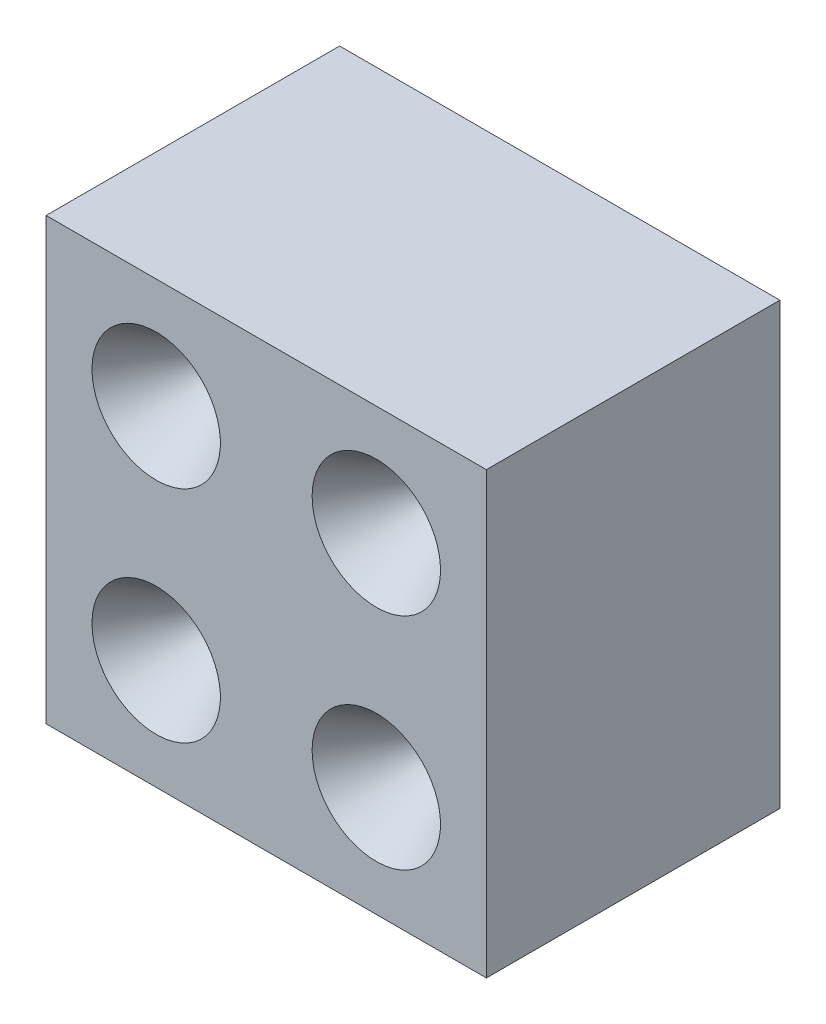
ISO-10303-21;
HEADER;
FILE_DESCRIPTION(('STEP AP214'),'2;1');
FILE_NAME('part.step','',(''),(''),'','','');
FILE_SCHEMA(('AUTOMOTIVE_DESIGN { 1 0 10303 214 1 1 1 1 }'));
ENDSEC;
DATA;
#1=APPLICATION_CONTEXT('core data for automotive mechanical design processes');
#2=APPLICATION_PROTOCOL_DEFINITION('international standard','automotive_design',2000,#1);
#3=PRODUCT_CONTEXT('',#1,'mechanical');
#4=PRODUCT('Part','Part','',(#3));
#5=PRODUCT_RELATED_PRODUCT_CATEGORY('part','',(#4));
#6=PRODUCT_DEFINITION_FORMATION('','',#4);
#7=PRODUCT_DEFINITION_CONTEXT('part definition',#1,'design');
#8=PRODUCT_DEFINITION('design','',#6,#7);
#9=PRODUCT_DEFINITION_SHAPE('','',#8);
#10=(LENGTH_UNIT() NAMED_UNIT(*) SI_UNIT(.MILLI.,.METRE.));
#11=(NAMED_UNIT(*) PLANE_ANGLE_UNIT() SI_UNIT($,.RADIAN.));
#12=(NAMED_UNIT(*) SI_UNIT($,.STERADIAN.) SOLID_ANGLE_UNIT());
#13=UNCERTAINTY_MEASURE_WITH_UNIT(LENGTH_MEASURE(1.E-05),#10,'distance_accuracy_value','');
#14=(GEOMETRIC_REPRESENTATION_CONTEXT(3) GLOBAL_UNCERTAINTY_ASSIGNED_CONTEXT((#13)) GLOBAL_UNIT_ASSIGNED_CONTEXT((#10,
#11,#12)) REPRESENTATION_CONTEXT('',''));
#15=CARTESIAN_POINT('',(0.,0.,0.));
#16=DIRECTION('',(0.,0.,1.));
#17=DIRECTION('',(1.,0.,0.));
#18=AXIS2_PLACEMENT_3D('',#15,#16,#17);
#19=CARTESIAN_POINT('',(0.,0.,2032.));
#20=DIRECTION('',(1.,0.,0.));
#21=DIRECTION('',(0.,0.,-1.));
#22=AXIS2_PLACEMENT_3D('',#19,#20,#21);
#23=PLANE('',#22);
#24=DIRECTION('',(0.,-1.,0.));
#25=VECTOR('',#24,1.);
#26=CARTESIAN_POINT('',(0.,0.,0.));
#27=LINE('',#26,#25);
#28=CARTESIAN_POINT('',(0.,3048.,0.));
#29=VERTEX_POINT('',#28);
#30=CARTESIAN_POINT('',(0.,0.,0.));
#31=VERTEX_POINT('',#30);
#32=EDGE_CURVE('E111',#29,#31,#27,.T.);
#33=ORIENTED_EDGE('',*,*,#32,.T.);
#34=DIRECTION('',(0.,0.,-1.));
#35=VECTOR('',#34,1.);
#36=CARTESIAN_POINT('',(0.,0.,2032.));
#37=LINE('',#36,#35);
#38=CARTESIAN_POINT('',(0.,0.,2032.));
#39=VERTEX_POINT('',#38);
#40=EDGE_CURVE('E12',#39,#31,#37,.T.);
#41=ORIENTED_EDGE('',*,*,#40,.F.);
#42=DIRECTION('',(0.,-1.,0.));
#43=VECTOR('',#42,1.);
#44=CARTESIAN_POINT('',(0.,0.,2032.));
#45=LINE('',#44,#43);
#46=CARTESIAN_POINT('',(0.,3048.,2032.));
#47=VERTEX_POINT('',#46);
#48=EDGE_CURVE('E98',#47,#39,#45,.T.);
#49=ORIENTED_EDGE('',*,*,#48,.F.);
#50=DIRECTION('',(0.,0.,-1.));
#51=VECTOR('',#50,1.);
#52=CARTESIAN_POINT('',(0.,3048.,2032.));
#53=LINE('',#52,#51);
#54=EDGE_CURVE('E107',#47,#29,#53,.T.);
#55=ORIENTED_EDGE('',*,*,#54,.T.);
#56=EDGE_LOOP('',(#33,#41,#49,#55));
#57=FACE_BOUND('',#56,.T.);
#58=ADVANCED_FACE('F43',(#57),#23,.F.);
#59=CARTESIAN_POINT('',(0.,0.,2032.));
#60=DIRECTION('',(0.,1.,0.));
#61=DIRECTION('',(0.,0.,1.));
#62=AXIS2_PLACEMENT_3D('',#59,#60,#61);
#63=PLANE('',#62);
#64=DIRECTION('',(1.,0.,0.));
#65=VECTOR('',#64,1.);
#66=CARTESIAN_POINT('',(0.,0.,0.));
#67=LINE('',#66,#65);
#68=CARTESIAN_POINT('',(3048.,0.,0.));
#69=VERTEX_POINT('',#68);
#70=EDGE_CURVE('E102',#31,#69,#67,.T.);
#71=ORIENTED_EDGE('',*,*,#70,.T.);
#72=DIRECTION('',(0.,0.,-1.));
#73=VECTOR('',#72,1.);
#74=CARTESIAN_POINT('',(3048.,0.,2032.));
#75=LINE('',#74,#73);
#76=CARTESIAN_POINT('',(3048.,0.,2032.));
#77=VERTEX_POINT('',#76);
#78=EDGE_CURVE('E54',#77,#69,#75,.T.);
#79=ORIENTED_EDGE('',*,*,#78,.F.);
#80=DIRECTION('',(1.,0.,0.));
#81=VECTOR('',#80,1.);
#82=CARTESIAN_POINT('',(0.,0.,2032.));
#83=LINE('',#82,#81);
#84=EDGE_CURVE('E93',#39,#77,#83,.T.);
#85=ORIENTED_EDGE('',*,*,#84,.F.);
#86=ORIENTED_EDGE('',*,*,#40,.T.);
#87=EDGE_LOOP('',(#71,#79,#85,#86));
#88=FACE_BOUND('',#87,.T.);
#89=ADVANCED_FACE('F101',(#88),#63,.F.);
#90=CARTESIAN_POINT('',(3048.,0.,2032.));
#91=DIRECTION('',(-1.,0.,0.));
#92=DIRECTION('',(0.,0.,1.));
#93=AXIS2_PLACEMENT_3D('',#90,#91,#92);
#94=PLANE('',#93);
#95=DIRECTION('',(0.,1.,0.));
#96=VECTOR('',#95,1.);
#97=CARTESIAN_POINT('',(3048.,0.,0.));
#98=LINE('',#97,#96);
#99=CARTESIAN_POINT('',(3048.,3048.,0.));
#100=VERTEX_POINT('',#99);
#101=EDGE_CURVE('E80',#69,#100,#98,.T.);
#102=ORIENTED_EDGE('',*,*,#101,.T.);
#103=DIRECTION('',(0.,0.,-1.));
#104=VECTOR('',#103,1.);
#105=CARTESIAN_POINT('',(3048.,3048.,2032.));
#106=LINE('',#105,#104);
#107=CARTESIAN_POINT('',(3048.,3048.,2032.));
#108=VERTEX_POINT('',#107);
#109=EDGE_CURVE('E103',#108,#100,#106,.T.);
#110=ORIENTED_EDGE('',*,*,#109,.F.);
#111=DIRECTION('',(0.,1.,0.));
#112=VECTOR('',#111,1.);
#113=CARTESIAN_POINT('',(3048.,0.,2032.));
#114=LINE('',#113,#112);
#115=EDGE_CURVE('E96',#77,#108,#114,.T.);
#116=ORIENTED_EDGE('',*,*,#115,.F.);
#117=ORIENTED_EDGE('',*,*,#78,.T.);
#118=EDGE_LOOP('',(#102,#110,#116,#117));
#119=FACE_BOUND('',#118,.T.);
#120=ADVANCED_FACE('F105',(#119),#94,.F.);
#121=CARTESIAN_POINT('',(0.,3048.,2032.));
#122=DIRECTION('',(0.,-1.,0.));
#123=DIRECTION('',(0.,0.,-1.));
#124=AXIS2_PLACEMENT_3D('',#121,#122,#123);
#125=PLANE('',#124);
#126=DIRECTION('',(-1.,0.,0.));
#127=VECTOR('',#126,1.);
#128=CARTESIAN_POINT('',(0.,3048.,0.));
#129=LINE('',#128,#127);
#130=EDGE_CURVE('E86',#100,#29,#129,.T.);
#131=ORIENTED_EDGE('',*,*,#130,.T.);
#132=ORIENTED_EDGE('',*,*,#54,.F.);
#133=DIRECTION('',(-1.,0.,0.));
#134=VECTOR('',#133,1.);
#135=CARTESIAN_POINT('',(0.,3048.,2032.));
#136=LINE('',#135,#134);
#137=EDGE_CURVE('E63',#108,#47,#136,.T.);
#138=ORIENTED_EDGE('',*,*,#137,.F.);
#139=ORIENTED_EDGE('',*,*,#109,.T.);
#140=EDGE_LOOP('',(#131,#132,#138,#139));
#141=FACE_BOUND('',#140,.T.);
#142=ADVANCED_FACE('F140',(#141),#125,.F.);
#143=CARTESIAN_POINT('',(0.,0.,2032.));
#144=DIRECTION('',(0.,0.,-1.));
#145=DIRECTION('',(-1.,0.,0.));
#146=AXIS2_PLACEMENT_3D('',#143,#144,#145);
#147=PLANE('',#146);
#148=CARTESIAN_POINT('',(2286.,762.,2032.));
#149=DIRECTION('',(0.,0.,1.));
#150=DIRECTION('',(1.,0.,0.));
#151=AXIS2_PLACEMENT_3D('',#148,#149,#150);
#152=CIRCLE('',#151,444.5);
#153=CARTESIAN_POINT('',(2729.52998755363,732.650380910873,2032.));
#154=VERTEX_POINT('',#153);
#155=EDGE_CURVE('E163',#154,#154,#152,.T.);
#156=ORIENTED_EDGE('',*,*,#155,.F.);
#157=EDGE_LOOP('',(#156));
#158=FACE_BOUND('',#157,.T.);
#159=CARTESIAN_POINT('',(2286.,2286.,2032.));
#160=DIRECTION('',(0.,0.,1.));
#161=DIRECTION('',(1.,0.,0.));
#162=AXIS2_PLACEMENT_3D('',#159,#160,#161);
#163=CIRCLE('',#162,444.5);
#164=CARTESIAN_POINT('',(2729.52998755363,2256.65038091087,2032.));
#165=VERTEX_POINT('',#164);
#166=EDGE_CURVE('E170',#165,#165,#163,.T.);
#167=ORIENTED_EDGE('',*,*,#166,.F.);
#168=EDGE_LOOP('',(#167));
#169=FACE_BOUND('',#168,.T.);
#170=CARTESIAN_POINT('',(762.,762.,2032.));
#171=DIRECTION('',(0.,0.,1.));
#172=DIRECTION('',(1.,0.,0.));
#173=AXIS2_PLACEMENT_3D('',#170,#171,#172);
#174=CIRCLE('',#173,444.5);
#175=CARTESIAN_POINT('',(1205.52998755363,732.650380910873,2032.));
#176=VERTEX_POINT('',#175);
#177=EDGE_CURVE('E248',#176,#176,#174,.T.);
#178=ORIENTED_EDGE('',*,*,#177,.F.);
#179=EDGE_LOOP('',(#178));
#180=FACE_BOUND('',#179,.T.);
#181=CARTESIAN_POINT('',(762.,2286.,2032.));
#182=DIRECTION('',(0.,0.,1.));
#183=DIRECTION('',(1.,0.,0.));
#184=AXIS2_PLACEMENT_3D('',#181,#182,#183);
#185=CIRCLE('',#184,444.5);
#186=CARTESIAN_POINT('',(1205.52998755363,2256.65038091087,2032.));
#187=VERTEX_POINT('',#186);
#188=EDGE_CURVE('E124',#187,#187,#185,.T.);
#189=ORIENTED_EDGE('',*,*,#188,.F.);
#190=EDGE_LOOP('',(#189));
#191=FACE_BOUND('',#190,.T.);
#192=ORIENTED_EDGE('',*,*,#48,.T.);
#193=ORIENTED_EDGE('',*,*,#84,.T.);
#194=ORIENTED_EDGE('',*,*,#115,.T.);
#195=ORIENTED_EDGE('',*,*,#137,.T.);
#196=EDGE_LOOP('',(#192,#193,#194,#195));
#197=FACE_BOUND('',#196,.T.);
#198=ADVANCED_FACE('F94',(#158,#169,#180,#191,#197),#147,.F.);
#199=CARTESIAN_POINT('',(0.,0.,0.));
#200=DIRECTION('',(0.,0.,-1.));
#201=DIRECTION('',(-1.,0.,0.));
#202=AXIS2_PLACEMENT_3D('',#199,#200,#201);
#203=PLANE('',#202);
#204=ORIENTED_EDGE('',*,*,#32,.F.);
#205=ORIENTED_EDGE('',*,*,#130,.F.);
#206=ORIENTED_EDGE('',*,*,#101,.F.);
#207=ORIENTED_EDGE('',*,*,#70,.F.);
#208=EDGE_LOOP('',(#204,#205,#206,#207));
#209=FACE_BOUND('',#208,.T.);
#210=ADVANCED_FACE('F139',(#209),#203,.T.);
#211=CARTESIAN_POINT('',(762.,2286.,1524.));
#212=DIRECTION('',(0.,0.,1.));
#213=DIRECTION('',(1.,0.,0.));
#214=AXIS2_PLACEMENT_3D('',#211,#212,#213);
#215=PLANE('',#214);
#216=CARTESIAN_POINT('',(762.,2286.,1524.));
#217=DIRECTION('',(0.,0.,1.));
#218=DIRECTION('',(1.,0.,0.));
#219=AXIS2_PLACEMENT_3D('',#216,#217,#218);
#220=CIRCLE('',#219,127.);
#221=CARTESIAN_POINT('',(885.845653168388,2314.12924085885,1524.));
#222=VERTEX_POINT('',#221);
#223=EDGE_CURVE('E114',#222,#222,#220,.T.);
#224=ORIENTED_EDGE('',*,*,#223,.T.);
#225=EDGE_LOOP('',(#224));
#226=FACE_BOUND('',#225,.T.);
#227=ADVANCED_FACE('F142',(#226),#215,.T.);
#228=CARTESIAN_POINT('',(1205.52998755363,2256.65038091087,2032.));
#229=CARTESIAN_POINT('',(885.845653168388,2314.12924085885,1524.));
#230=CARTESIAN_POINT('',(1146.83074937538,1369.59040580361,2032.));
#231=CARTESIAN_POINT('',(942.10413488609,2066.43793452207,1524.));
#232=CARTESIAN_POINT('',(259.770774268116,1428.28964398187,2032.));
#233=CARTESIAN_POINT('',(694.412828549313,2010.17945280437,1524.));
#234=CARTESIAN_POINT('',(318.47001244637,2315.34961908913,2032.));
#235=CARTESIAN_POINT('',(638.154346831612,2257.87075914115,1524.));
#236=CARTESIAN_POINT('',(377.169250624623,3202.40959419639,2032.));
#237=CARTESIAN_POINT('',(581.89586511391,2505.56206547793,1524.));
#238=CARTESIAN_POINT('',(1264.22922573188,3143.71035601813,2032.));
#239=CARTESIAN_POINT('',(829.587171450686,2561.82054719563,1524.));
#240=CARTESIAN_POINT('',(1205.52998755363,2256.65038091087,2032.));
#241=CARTESIAN_POINT('',(885.845653168388,2314.12924085885,1524.));
#242=(BOUNDED_SURFACE() B_SPLINE_SURFACE(3,1,((#228,#229),(#230,#231),(#232,#233),(#234,#235),
(#236,#237),(#238,#239),(#240,#241)),.UNSPECIFIED.,.T.,.F.,.F.) B_SPLINE_SURFACE_WITH_KNOTS((4,
3,4),(2,2),(0.,0.5,1.),(0.,1.),
.UNSPECIFIED.) GEOMETRIC_REPRESENTATION_ITEM() RATIONAL_B_SPLINE_SURFACE(((1.,1.),
(0.333333333333333,0.333333333333333),(0.333333333333333,0.333333333333333),(1.,1.),
(0.333333333333333,0.333333333333333),(0.333333333333333,0.333333333333333),(1.,1.))) REPRESENTATION_ITEM('') SURFACE());
#243=CARTESIAN_POINT('',(1205.52998755363,2256.65038091087,2032.));
#244=CARTESIAN_POINT('',(1202.19994240378,2257.24911903533,2026.70833333333));
#245=CARTESIAN_POINT('',(1198.86989725394,2257.84785715979,2021.41666666667));
#246=CARTESIAN_POINT('',(1192.20980695425,2259.04533340871,2010.83333333333));
#247=CARTESIAN_POINT('',(1188.8797618044,2259.64407153316,2005.54166666667));
#248=CARTESIAN_POINT('',(1182.21967150471,2260.84154778208,1994.95833333333));
#249=CARTESIAN_POINT('',(1178.88962635486,2261.44028590654,1989.66666666667));
#250=CARTESIAN_POINT('',(1172.22953605517,2262.63776215545,1979.08333333333));
#251=CARTESIAN_POINT('',(1168.89949090532,2263.23650027991,1973.79166666667));
#252=CARTESIAN_POINT('',(1162.23940060563,2264.43397652883,1963.20833333333));
#253=CARTESIAN_POINT('',(1158.90935545578,2265.03271465329,1957.91666666667));
#254=CARTESIAN_POINT('',(1152.24926515609,2266.2301909022,1947.33333333333));
#255=CARTESIAN_POINT('',(1148.91922000624,2266.82892902666,1942.04166666667));
#256=CARTESIAN_POINT('',(1142.25912970655,2268.02640527558,1931.45833333333));
#257=CARTESIAN_POINT('',(1138.9290845567,2268.62514340004,1926.16666666667));
#258=CARTESIAN_POINT('',(1132.26899425701,2269.82261964895,1915.58333333333));
#259=CARTESIAN_POINT('',(1128.93894910717,2270.42135777341,1910.29166666667));
#260=CARTESIAN_POINT('',(1122.27885880747,2271.61883402233,1899.70833333333));
#261=CARTESIAN_POINT('',(1118.94881365763,2272.21757214678,1894.41666666667));
#262=CARTESIAN_POINT('',(1112.28872335793,2273.4150483957,1883.83333333333));
#263=CARTESIAN_POINT('',(1108.95867820809,2274.01378652016,1878.54166666667));
#264=CARTESIAN_POINT('',(1102.2985879084,2275.21126276907,1867.95833333333));
#265=CARTESIAN_POINT('',(1098.96854275855,2275.81000089353,1862.66666666667));
#266=CARTESIAN_POINT('',(1092.30845245886,2277.00747714245,1852.08333333333));
#267=CARTESIAN_POINT('',(1088.97840730901,2277.60621526691,1846.79166666667));
#268=CARTESIAN_POINT('',(1082.31831700932,2278.80369151582,1836.20833333333));
#269=CARTESIAN_POINT('',(1078.98827185947,2279.40242964028,1830.91666666667));
#270=CARTESIAN_POINT('',(1072.32818155978,2280.5999058892,1820.33333333333));
#271=CARTESIAN_POINT('',(1068.99813640993,2281.19864401366,1815.04166666667));
#272=CARTESIAN_POINT('',(1062.33804611024,2282.39612026257,1804.45833333333));
#273=CARTESIAN_POINT('',(1059.00800096039,2282.99485838703,1799.16666666667));
#274=CARTESIAN_POINT('',(1052.3479106607,2284.19233463595,1788.58333333333));
#275=CARTESIAN_POINT('',(1049.01786551086,2284.7910727604,1783.29166666667));
#276=CARTESIAN_POINT('',(1042.35777521116,2285.98854900932,1772.70833333333));
#277=CARTESIAN_POINT('',(1039.02773006132,2286.58728713378,1767.41666666667));
#278=CARTESIAN_POINT('',(1032.36763976162,2287.78476338269,1756.83333333333));
#279=CARTESIAN_POINT('',(1029.03759461178,2288.38350150715,1751.54166666667));
#280=CARTESIAN_POINT('',(1022.37750431209,2289.58097775607,1740.95833333333));
#281=CARTESIAN_POINT('',(1019.04745916224,2290.17971588053,1735.66666666667));
#282=CARTESIAN_POINT('',(1012.38736886255,2291.37719212944,1725.08333333333));
#283=CARTESIAN_POINT('',(1009.0573237127,2291.9759302539,1719.79166666667));
#284=CARTESIAN_POINT('',(1002.39723341301,2293.17340650282,1709.20833333333));
#285=CARTESIAN_POINT('',(999.067188263162,2293.77214462728,1703.91666666667));
#286=CARTESIAN_POINT('',(992.407097963469,2294.96962087619,1693.33333333333));
#287=CARTESIAN_POINT('',(989.077052813623,2295.56835900065,1688.04166666667));
#288=CARTESIAN_POINT('',(982.41696251393,2296.76583524957,1677.45833333333));
#289=CARTESIAN_POINT('',(979.086917364084,2297.36457337402,1672.16666666667));
#290=CARTESIAN_POINT('',(972.426827064391,2298.56204962294,1661.58333333333));
#291=CARTESIAN_POINT('',(969.096781914545,2299.1607877474,1656.29166666667));
#292=CARTESIAN_POINT('',(962.436691614853,2300.35826399631,1645.70833333333));
#293=CARTESIAN_POINT('',(959.106646465006,2300.95700212077,1640.41666666667));
#294=CARTESIAN_POINT('',(952.446556165314,2302.15447836969,1629.83333333333));
#295=CARTESIAN_POINT('',(949.116511015468,2302.75321649415,1624.54166666667));
#296=CARTESIAN_POINT('',(942.456420715775,2303.95069274306,1613.95833333333));
#297=CARTESIAN_POINT('',(939.126375565929,2304.54943086752,1608.66666666667));
#298=CARTESIAN_POINT('',(932.466285266236,2305.74690711644,1598.08333333333));
#299=CARTESIAN_POINT('',(929.13624011639,2306.3456452409,1592.79166666667));
#300=CARTESIAN_POINT('',(922.476149816697,2307.54312148981,1582.20833333333));
#301=CARTESIAN_POINT('',(919.146104666851,2308.14185961427,1576.91666666667));
#302=CARTESIAN_POINT('',(912.486014367159,2309.33933586319,1566.33333333333));
#303=CARTESIAN_POINT('',(909.155969217312,2309.93807398764,1561.04166666667));
#304=CARTESIAN_POINT('',(902.49587891762,2311.13555023656,1550.45833333333));
#305=CARTESIAN_POINT('',(899.165833767773,2311.73428836102,1545.16666666667));
#306=CARTESIAN_POINT('',(892.505743468081,2312.93176460993,1534.58333333333));
#307=CARTESIAN_POINT('',(889.175698318235,2313.53050273439,1529.29166666667));
#308=CARTESIAN_POINT('',(885.845653168388,2314.12924085885,1524.));
#309=B_SPLINE_CURVE_WITH_KNOTS('',3,(#243,#244,#245,#246,#247,#248,#249,#250,#251,#252,#253,
#254,#255,#256,#257,#258,#259,#260,#261,#262,#263,#264,#265,#266,#267,#268,#269,#270,#271,#272,
#273,#274,#275,#276,#277,#278,#279,#280,#281,#282,#283,#284,#285,#286,#287,#288,#289,#290,#291,
#292,#293,#294,#295,#296,#297,#298,#299,#300,#301,#302,#303,#304,#305,#306,#307,#308),
.UNSPECIFIED.,.F.,.F.,(4,2,2,2,2,2,2,2,2,2,2,2,2,2,2,2,2,2,2,2,2,2,2,2,2,2,2,2,2,2,2,2,4),(0.,
18.8426329735323,37.6852659470649,56.527898920597,75.3705318941293,94.2131648676617,
113.055797841194,131.898430814726,150.741063788259,169.583696761791,188.426329735323,
207.268962708856,226.111595682388,244.954228655921,263.796861629453,282.639494602985,
301.482127576518,320.32476055005,339.167393523582,358.010026497115,376.852659470647,
395.69529244418,414.537925417712,433.380558391244,452.223191364776,471.065824338309,
489.908457311841,508.751090285373,527.593723258906,546.436356232438,565.278989205971,
584.121622179503,602.964255153035),.UNSPECIFIED.);
#310=EDGE_CURVE('BSEAM311',#187,#222,#309,.T.);
#311=ORIENTED_EDGE('',*,*,#188,.T.);
#312=ORIENTED_EDGE('',*,*,#223,.F.);
#313=ORIENTED_EDGE('',*,*,#310,.T.);
#314=ORIENTED_EDGE('',*,*,#310,.F.);
#315=EDGE_LOOP('',(#311,#313,#312,#314));
#316=FACE_BOUND('',#315,.T.);
#317=ADVANCED_FACE('F311',(#316),#242,.F.);
#318=CARTESIAN_POINT('',(762.,762.,1524.));
#319=DIRECTION('',(0.,0.,1.));
#320=DIRECTION('',(1.,0.,0.));
#321=AXIS2_PLACEMENT_3D('',#318,#319,#320);
#322=PLANE('',#321);
#323=CARTESIAN_POINT('',(762.,762.,1524.));
#324=DIRECTION('',(0.,0.,1.));
#325=DIRECTION('',(1.,0.,0.));
#326=AXIS2_PLACEMENT_3D('',#323,#324,#325);
#327=CIRCLE('',#326,127.);
#328=CARTESIAN_POINT('',(885.845653168388,790.129240858851,1524.));
#329=VERTEX_POINT('',#328);
#330=EDGE_CURVE('E287',#329,#329,#327,.T.);
#331=ORIENTED_EDGE('',*,*,#330,.T.);
#332=EDGE_LOOP('',(#331));
#333=FACE_BOUND('',#332,.T.);
#334=ADVANCED_FACE('F270',(#333),#322,.T.);
#335=CARTESIAN_POINT('',(1205.52998755363,732.650380910873,2032.));
#336=CARTESIAN_POINT('',(885.845653168388,790.129240858851,1524.));
#337=CARTESIAN_POINT('',(1146.83074937538,-154.409594196388,2032.));
#338=CARTESIAN_POINT('',(942.10413488609,542.437934522074,1524.));
#339=CARTESIAN_POINT('',(259.770774268116,-95.7103560181338,2032.));
#340=CARTESIAN_POINT('',(694.412828549313,486.179452804372,1524.));
#341=CARTESIAN_POINT('',(318.47001244637,791.349619089127,2032.));
#342=CARTESIAN_POINT('',(638.154346831612,733.870759141149,1524.));
#343=CARTESIAN_POINT('',(377.169250624623,1678.40959419639,2032.));
#344=CARTESIAN_POINT('',(581.89586511391,981.562065477926,1524.));
#345=CARTESIAN_POINT('',(1264.22922573188,1619.71035601813,2032.));
#346=CARTESIAN_POINT('',(829.587171450686,1037.82054719563,1524.));
#347=CARTESIAN_POINT('',(1205.52998755363,732.650380910873,2032.));
#348=CARTESIAN_POINT('',(885.845653168388,790.129240858851,1524.));
#349=(BOUNDED_SURFACE() B_SPLINE_SURFACE(3,1,((#335,#336),(#337,#338),(#339,#340),(#341,#342),
(#343,#344),(#345,#346),(#347,#348)),.UNSPECIFIED.,.T.,.F.,.F.) B_SPLINE_SURFACE_WITH_KNOTS((4,
3,4),(2,2),(0.,0.5,1.),(0.,1.),
.UNSPECIFIED.) GEOMETRIC_REPRESENTATION_ITEM() RATIONAL_B_SPLINE_SURFACE(((1.,1.),
(0.333333333333333,0.333333333333333),(0.333333333333333,0.333333333333333),(1.,1.),
(0.333333333333333,0.333333333333333),(0.333333333333333,0.333333333333333),(1.,1.))) REPRESENTATION_ITEM('') SURFACE());
#350=CARTESIAN_POINT('',(1205.52998755363,732.650380910873,2032.));
#351=CARTESIAN_POINT('',(1202.19994240378,733.249119035331,2026.70833333333));
#352=CARTESIAN_POINT('',(1198.86989725394,733.847857159789,2021.41666666667));
#353=CARTESIAN_POINT('',(1192.20980695425,735.045333408705,2010.83333333333));
#354=CARTESIAN_POINT('',(1188.8797618044,735.644071533164,2005.54166666667));
#355=CARTESIAN_POINT('',(1182.21967150471,736.84154778208,1994.95833333333));
#356=CARTESIAN_POINT('',(1178.88962635486,737.440285906538,1989.66666666667));
#357=CARTESIAN_POINT('',(1172.22953605517,738.637762155454,1979.08333333333));
#358=CARTESIAN_POINT('',(1168.89949090532,739.236500279912,1973.79166666667));
#359=CARTESIAN_POINT('',(1162.23940060563,740.433976528828,1963.20833333333));
#360=CARTESIAN_POINT('',(1158.90935545578,741.032714653287,1957.91666666667));
#361=CARTESIAN_POINT('',(1152.24926515609,742.230190902203,1947.33333333333));
#362=CARTESIAN_POINT('',(1148.91922000624,742.828929026661,1942.04166666667));
#363=CARTESIAN_POINT('',(1142.25912970655,744.026405275577,1931.45833333333));
#364=CARTESIAN_POINT('',(1138.9290845567,744.625143400035,1926.16666666667));
#365=CARTESIAN_POINT('',(1132.26899425701,745.822619648951,1915.58333333333));
#366=CARTESIAN_POINT('',(1128.93894910717,746.421357773409,1910.29166666667));
#367=CARTESIAN_POINT('',(1122.27885880747,747.618834022326,1899.70833333333));
#368=CARTESIAN_POINT('',(1118.94881365763,748.217572146784,1894.41666666667));
#369=CARTESIAN_POINT('',(1112.28872335793,749.4150483957,1883.83333333333));
#370=CARTESIAN_POINT('',(1108.95867820809,750.013786520158,1878.54166666667));
#371=CARTESIAN_POINT('',(1102.2985879084,751.211262769074,1867.95833333333));
#372=CARTESIAN_POINT('',(1098.96854275855,751.810000893532,1862.66666666667));
#373=CARTESIAN_POINT('',(1092.30845245886,753.007477142449,1852.08333333333));
#374=CARTESIAN_POINT('',(1088.97840730901,753.606215266907,1846.79166666667));
#375=CARTESIAN_POINT('',(1082.31831700932,754.803691515823,1836.20833333333));
#376=CARTESIAN_POINT('',(1078.98827185947,755.402429640281,1830.91666666667));
#377=CARTESIAN_POINT('',(1072.32818155978,756.599905889197,1820.33333333333));
#378=CARTESIAN_POINT('',(1068.99813640993,757.198644013655,1815.04166666667));
#379=CARTESIAN_POINT('',(1062.33804611024,758.396120262572,1804.45833333333));
#380=CARTESIAN_POINT('',(1059.00800096039,758.99485838703,1799.16666666667));
#381=CARTESIAN_POINT('',(1052.3479106607,760.192334635946,1788.58333333333));
#382=CARTESIAN_POINT('',(1049.01786551086,760.791072760404,1783.29166666667));
#383=CARTESIAN_POINT('',(1042.35777521116,761.98854900932,1772.70833333333));
#384=CARTESIAN_POINT('',(1039.02773006132,762.587287133778,1767.41666666667));
#385=CARTESIAN_POINT('',(1032.36763976162,763.784763382694,1756.83333333333));
#386=CARTESIAN_POINT('',(1029.03759461178,764.383501507152,1751.54166666667));
#387=CARTESIAN_POINT('',(1022.37750431209,765.580977756069,1740.95833333333));
#388=CARTESIAN_POINT('',(1019.04745916224,766.179715880527,1735.66666666667));
#389=CARTESIAN_POINT('',(1012.38736886255,767.377192129443,1725.08333333333));
#390=CARTESIAN_POINT('',(1009.0573237127,767.975930253901,1719.79166666667));
#391=CARTESIAN_POINT('',(1002.39723341301,769.173406502817,1709.20833333333));
#392=CARTESIAN_POINT('',(999.067188263162,769.772144627275,1703.91666666667));
#393=CARTESIAN_POINT('',(992.407097963469,770.969620876192,1693.33333333333));
#394=CARTESIAN_POINT('',(989.077052813623,771.56835900065,1688.04166666667));
#395=CARTESIAN_POINT('',(982.41696251393,772.765835249566,1677.45833333333));
#396=CARTESIAN_POINT('',(979.086917364084,773.364573374024,1672.16666666667));
#397=CARTESIAN_POINT('',(972.426827064391,774.56204962294,1661.58333333333));
#398=CARTESIAN_POINT('',(969.096781914545,775.160787747398,1656.29166666667));
#399=CARTESIAN_POINT('',(962.436691614853,776.358263996315,1645.70833333333));
#400=CARTESIAN_POINT('',(959.106646465006,776.957002120773,1640.41666666667));
#401=CARTESIAN_POINT('',(952.446556165314,778.154478369689,1629.83333333333));
#402=CARTESIAN_POINT('',(949.116511015468,778.753216494147,1624.54166666667));
#403=CARTESIAN_POINT('',(942.456420715775,779.950692743063,1613.95833333333));
#404=CARTESIAN_POINT('',(939.126375565929,780.549430867521,1608.66666666667));
#405=CARTESIAN_POINT('',(932.466285266236,781.746907116437,1598.08333333333));
#406=CARTESIAN_POINT('',(929.13624011639,782.345645240896,1592.79166666667));
#407=CARTESIAN_POINT('',(922.476149816697,783.543121489812,1582.20833333333));
#408=CARTESIAN_POINT('',(919.146104666851,784.14185961427,1576.91666666667));
#409=CARTESIAN_POINT('',(912.486014367159,785.339335863186,1566.33333333333));
#410=CARTESIAN_POINT('',(909.155969217312,785.938073987644,1561.04166666667));
#411=CARTESIAN_POINT('',(902.49587891762,787.13555023656,1550.45833333333));
#412=CARTESIAN_POINT('',(899.165833767773,787.734288361019,1545.16666666667));
#413=CARTESIAN_POINT('',(892.505743468081,788.931764609935,1534.58333333333));
#414=CARTESIAN_POINT('',(889.175698318235,789.530502734393,1529.29166666667));
#415=CARTESIAN_POINT('',(885.845653168388,790.129240858851,1524.));
#416=B_SPLINE_CURVE_WITH_KNOTS('',3,(#350,#351,#352,#353,#354,#355,#356,#357,#358,#359,#360,
#361,#362,#363,#364,#365,#366,#367,#368,#369,#370,#371,#372,#373,#374,#375,#376,#377,#378,#379,
#380,#381,#382,#383,#384,#385,#386,#387,#388,#389,#390,#391,#392,#393,#394,#395,#396,#397,#398,
#399,#400,#401,#402,#403,#404,#405,#406,#407,#408,#409,#410,#411,#412,#413,#414,#415),
.UNSPECIFIED.,.F.,.F.,(4,2,2,2,2,2,2,2,2,2,2,2,2,2,2,2,2,2,2,2,2,2,2,2,2,2,2,2,2,2,2,2,4),(0.,
18.8426329735323,37.6852659470649,56.527898920597,75.3705318941293,94.2131648676617,
113.055797841194,131.898430814726,150.741063788259,169.583696761791,188.426329735323,
207.268962708856,226.111595682388,244.954228655921,263.796861629453,282.639494602985,
301.482127576518,320.32476055005,339.167393523582,358.010026497115,376.852659470647,
395.69529244418,414.537925417712,433.380558391244,452.223191364776,471.065824338309,
489.908457311841,508.751090285373,527.593723258906,546.436356232438,565.278989205971,
584.121622179503,602.964255153035),.UNSPECIFIED.);
#417=EDGE_CURVE('BSEAM259',#176,#329,#416,.T.);
#418=ORIENTED_EDGE('',*,*,#177,.T.);
#419=ORIENTED_EDGE('',*,*,#330,.F.);
#420=ORIENTED_EDGE('',*,*,#417,.T.);
#421=ORIENTED_EDGE('',*,*,#417,.F.);
#422=EDGE_LOOP('',(#418,#420,#419,#421));
#423=FACE_BOUND('',#422,.T.);
#424=ADVANCED_FACE('F259',(#423),#349,.F.);
#425=CARTESIAN_POINT('',(2286.,2286.,1524.));
#426=DIRECTION('',(0.,0.,1.));
#427=DIRECTION('',(1.,0.,0.));
#428=AXIS2_PLACEMENT_3D('',#425,#426,#427);
#429=PLANE('',#428);
#430=CARTESIAN_POINT('',(2286.,2286.,1524.));
#431=DIRECTION('',(0.,0.,1.));
#432=DIRECTION('',(1.,0.,0.));
#433=AXIS2_PLACEMENT_3D('',#430,#431,#432);
#434=CIRCLE('',#433,127.);
#435=CARTESIAN_POINT('',(2409.84565316839,2314.12924085885,1524.));
#436=VERTEX_POINT('',#435);
#437=EDGE_CURVE('E233',#436,#436,#434,.T.);
#438=ORIENTED_EDGE('',*,*,#437,.T.);
#439=EDGE_LOOP('',(#438));
#440=FACE_BOUND('',#439,.T.);
#441=ADVANCED_FACE('F206',(#440),#429,.T.);
#442=CARTESIAN_POINT('',(2729.52998755363,2256.65038091087,2032.));
#443=CARTESIAN_POINT('',(2409.84565316839,2314.12924085885,1524.));
#444=CARTESIAN_POINT('',(2670.83074937538,1369.59040580361,2032.));
#445=CARTESIAN_POINT('',(2466.10413488609,2066.43793452207,1524.));
#446=CARTESIAN_POINT('',(1783.77077426812,1428.28964398187,2032.));
#447=CARTESIAN_POINT('',(2218.41282854931,2010.17945280437,1524.));
#448=CARTESIAN_POINT('',(1842.47001244637,2315.34961908913,2032.));
#449=CARTESIAN_POINT('',(2162.15434683161,2257.87075914115,1524.));
#450=CARTESIAN_POINT('',(1901.16925062462,3202.40959419639,2032.));
#451=CARTESIAN_POINT('',(2105.89586511391,2505.56206547793,1524.));
#452=CARTESIAN_POINT('',(2788.22922573188,3143.71035601813,2032.));
#453=CARTESIAN_POINT('',(2353.58717145069,2561.82054719563,1524.));
#454=CARTESIAN_POINT('',(2729.52998755363,2256.65038091087,2032.));
#455=CARTESIAN_POINT('',(2409.84565316839,2314.12924085885,1524.));
#456=(BOUNDED_SURFACE() B_SPLINE_SURFACE(3,1,((#442,#443),(#444,#445),(#446,#447),(#448,#449),
(#450,#451),(#452,#453),(#454,#455)),.UNSPECIFIED.,.T.,.F.,.F.) B_SPLINE_SURFACE_WITH_KNOTS((4,
3,4),(2,2),(0.,0.5,1.),(0.,1.),
.UNSPECIFIED.) GEOMETRIC_REPRESENTATION_ITEM() RATIONAL_B_SPLINE_SURFACE(((1.,1.),
(0.333333333333333,0.333333333333333),(0.333333333333333,0.333333333333333),(1.,1.),
(0.333333333333333,0.333333333333333),(0.333333333333333,0.333333333333333),(1.,1.))) REPRESENTATION_ITEM('') SURFACE());
#457=CARTESIAN_POINT('',(2729.52998755363,2256.65038091087,2032.));
#458=CARTESIAN_POINT('',(2726.19994240378,2257.24911903533,2026.70833333333));
#459=CARTESIAN_POINT('',(2722.86989725394,2257.84785715979,2021.41666666667));
#460=CARTESIAN_POINT('',(2716.20980695425,2259.04533340871,2010.83333333333));
#461=CARTESIAN_POINT('',(2712.8797618044,2259.64407153316,2005.54166666667));
#462=CARTESIAN_POINT('',(2706.21967150471,2260.84154778208,1994.95833333333));
#463=CARTESIAN_POINT('',(2702.88962635486,2261.44028590654,1989.66666666667));
#464=CARTESIAN_POINT('',(2696.22953605517,2262.63776215545,1979.08333333333));
#465=CARTESIAN_POINT('',(2692.89949090532,2263.23650027991,1973.79166666667));
#466=CARTESIAN_POINT('',(2686.23940060563,2264.43397652883,1963.20833333333));
#467=CARTESIAN_POINT('',(2682.90935545578,2265.03271465329,1957.91666666667));
#468=CARTESIAN_POINT('',(2676.24926515609,2266.2301909022,1947.33333333333));
#469=CARTESIAN_POINT('',(2672.91922000624,2266.82892902666,1942.04166666667));
#470=CARTESIAN_POINT('',(2666.25912970655,2268.02640527558,1931.45833333333));
#471=CARTESIAN_POINT('',(2662.9290845567,2268.62514340004,1926.16666666667));
#472=CARTESIAN_POINT('',(2656.26899425701,2269.82261964895,1915.58333333333));
#473=CARTESIAN_POINT('',(2652.93894910717,2270.42135777341,1910.29166666667));
#474=CARTESIAN_POINT('',(2646.27885880747,2271.61883402233,1899.70833333333));
#475=CARTESIAN_POINT('',(2642.94881365763,2272.21757214678,1894.41666666667));
#476=CARTESIAN_POINT('',(2636.28872335793,2273.4150483957,1883.83333333333));
#477=CARTESIAN_POINT('',(2632.95867820809,2274.01378652016,1878.54166666667));
#478=CARTESIAN_POINT('',(2626.2985879084,2275.21126276907,1867.95833333333));
#479=CARTESIAN_POINT('',(2622.96854275855,2275.81000089353,1862.66666666667));
#480=CARTESIAN_POINT('',(2616.30845245886,2277.00747714245,1852.08333333333));
#481=CARTESIAN_POINT('',(2612.97840730901,2277.60621526691,1846.79166666667));
#482=CARTESIAN_POINT('',(2606.31831700932,2278.80369151582,1836.20833333333));
#483=CARTESIAN_POINT('',(2602.98827185947,2279.40242964028,1830.91666666667));
#484=CARTESIAN_POINT('',(2596.32818155978,2280.5999058892,1820.33333333333));
#485=CARTESIAN_POINT('',(2592.99813640993,2281.19864401366,1815.04166666667));
#486=CARTESIAN_POINT('',(2586.33804611024,2282.39612026257,1804.45833333333));
#487=CARTESIAN_POINT('',(2583.00800096039,2282.99485838703,1799.16666666667));
#488=CARTESIAN_POINT('',(2576.3479106607,2284.19233463595,1788.58333333333));
#489=CARTESIAN_POINT('',(2573.01786551086,2284.7910727604,1783.29166666667));
#490=CARTESIAN_POINT('',(2566.35777521116,2285.98854900932,1772.70833333333));
#491=CARTESIAN_POINT('',(2563.02773006132,2286.58728713378,1767.41666666667));
#492=CARTESIAN_POINT('',(2556.36763976162,2287.78476338269,1756.83333333333));
#493=CARTESIAN_POINT('',(2553.03759461178,2288.38350150715,1751.54166666667));
#494=CARTESIAN_POINT('',(2546.37750431209,2289.58097775607,1740.95833333333));
#495=CARTESIAN_POINT('',(2543.04745916224,2290.17971588053,1735.66666666667));
#496=CARTESIAN_POINT('',(2536.38736886255,2291.37719212944,1725.08333333333));
#497=CARTESIAN_POINT('',(2533.0573237127,2291.9759302539,1719.79166666667));
#498=CARTESIAN_POINT('',(2526.39723341301,2293.17340650282,1709.20833333333));
#499=CARTESIAN_POINT('',(2523.06718826316,2293.77214462728,1703.91666666667));
#500=CARTESIAN_POINT('',(2516.40709796347,2294.96962087619,1693.33333333333));
#501=CARTESIAN_POINT('',(2513.07705281362,2295.56835900065,1688.04166666667));
#502=CARTESIAN_POINT('',(2506.41696251393,2296.76583524957,1677.45833333333));
#503=CARTESIAN_POINT('',(2503.08691736408,2297.36457337402,1672.16666666667));
#504=CARTESIAN_POINT('',(2496.42682706439,2298.56204962294,1661.58333333333));
#505=CARTESIAN_POINT('',(2493.09678191455,2299.1607877474,1656.29166666667));
#506=CARTESIAN_POINT('',(2486.43669161485,2300.35826399631,1645.70833333333));
#507=CARTESIAN_POINT('',(2483.10664646501,2300.95700212077,1640.41666666667));
#508=CARTESIAN_POINT('',(2476.44655616531,2302.15447836969,1629.83333333333));
#509=CARTESIAN_POINT('',(2473.11651101547,2302.75321649415,1624.54166666667));
#510=CARTESIAN_POINT('',(2466.45642071578,2303.95069274306,1613.95833333333));
#511=CARTESIAN_POINT('',(2463.12637556593,2304.54943086752,1608.66666666667));
#512=CARTESIAN_POINT('',(2456.46628526624,2305.74690711644,1598.08333333333));
#513=CARTESIAN_POINT('',(2453.13624011639,2306.3456452409,1592.79166666667));
#514=CARTESIAN_POINT('',(2446.4761498167,2307.54312148981,1582.20833333333));
#515=CARTESIAN_POINT('',(2443.14610466685,2308.14185961427,1576.91666666667));
#516=CARTESIAN_POINT('',(2436.48601436716,2309.33933586319,1566.33333333333));
#517=CARTESIAN_POINT('',(2433.15596921731,2309.93807398764,1561.04166666667));
#518=CARTESIAN_POINT('',(2426.49587891762,2311.13555023656,1550.45833333333));
#519=CARTESIAN_POINT('',(2423.16583376777,2311.73428836102,1545.16666666667));
#520=CARTESIAN_POINT('',(2416.50574346808,2312.93176460993,1534.58333333333));
#521=CARTESIAN_POINT('',(2413.17569831823,2313.53050273439,1529.29166666667));
#522=CARTESIAN_POINT('',(2409.84565316839,2314.12924085885,1524.));
#523=B_SPLINE_CURVE_WITH_KNOTS('',3,(#457,#458,#459,#460,#461,#462,#463,#464,#465,#466,#467,
#468,#469,#470,#471,#472,#473,#474,#475,#476,#477,#478,#479,#480,#481,#482,#483,#484,#485,#486,
#487,#488,#489,#490,#491,#492,#493,#494,#495,#496,#497,#498,#499,#500,#501,#502,#503,#504,#505,
#506,#507,#508,#509,#510,#511,#512,#513,#514,#515,#516,#517,#518,#519,#520,#521,#522),
.UNSPECIFIED.,.F.,.F.,(4,2,2,2,2,2,2,2,2,2,2,2,2,2,2,2,2,2,2,2,2,2,2,2,2,2,2,2,2,2,2,2,4),(0.,
18.8426329735323,37.6852659470649,56.5278989205969,75.3705318941292,94.2131648676616,
113.055797841194,131.898430814727,150.741063788259,169.583696761791,188.426329735323,
207.268962708856,226.111595682388,244.95422865592,263.796861629453,282.639494602985,
301.482127576518,320.32476055005,339.167393523582,358.010026497115,376.852659470647,
395.69529244418,414.537925417712,433.380558391244,452.223191364776,471.065824338309,
489.908457311841,508.751090285373,527.593723258906,546.436356232438,565.27898920597,
584.121622179503,602.964255153035),.UNSPECIFIED.);
#524=EDGE_CURVE('BSEAM197',#165,#436,#523,.T.);
#525=ORIENTED_EDGE('',*,*,#166,.T.);
#526=ORIENTED_EDGE('',*,*,#437,.F.);
#527=ORIENTED_EDGE('',*,*,#524,.T.);
#528=ORIENTED_EDGE('',*,*,#524,.F.);
#529=EDGE_LOOP('',(#525,#527,#526,#528));
#530=FACE_BOUND('',#529,.T.);
#531=ADVANCED_FACE('F197',(#530),#456,.F.);
#532=CARTESIAN_POINT('',(2286.,762.,1524.));
#533=DIRECTION('',(0.,0.,1.));
#534=DIRECTION('',(1.,0.,0.));
#535=AXIS2_PLACEMENT_3D('',#532,#533,#534);
#536=PLANE('',#535);
#537=CARTESIAN_POINT('',(2286.,762.,1524.));
#538=DIRECTION('',(0.,0.,1.));
#539=DIRECTION('',(1.,0.,0.));
#540=AXIS2_PLACEMENT_3D('',#537,#538,#539);
#541=CIRCLE('',#540,127.);
#542=CARTESIAN_POINT('',(2409.84565316839,790.129240858851,1524.));
#543=VERTEX_POINT('',#542);
#544=EDGE_CURVE('E167',#543,#543,#541,.T.);
#545=ORIENTED_EDGE('',*,*,#544,.T.);
#546=EDGE_LOOP('',(#545));
#547=FACE_BOUND('',#546,.T.);
#548=ADVANCED_FACE('F187',(#547),#536,.T.);
#549=CARTESIAN_POINT('',(2729.52998755363,732.650380910873,2032.));
#550=CARTESIAN_POINT('',(2409.84565316839,790.129240858851,1524.));
#551=CARTESIAN_POINT('',(2670.83074937538,-154.409594196388,2032.));
#552=CARTESIAN_POINT('',(2466.10413488609,542.437934522074,1524.));
#553=CARTESIAN_POINT('',(1783.77077426812,-95.7103560181338,2032.));
#554=CARTESIAN_POINT('',(2218.41282854931,486.179452804372,1524.));
#555=CARTESIAN_POINT('',(1842.47001244637,791.349619089127,2032.));
#556=CARTESIAN_POINT('',(2162.15434683161,733.870759141149,1524.));
#557=CARTESIAN_POINT('',(1901.16925062462,1678.40959419639,2032.));
#558=CARTESIAN_POINT('',(2105.89586511391,981.562065477926,1524.));
#559=CARTESIAN_POINT('',(2788.22922573188,1619.71035601813,2032.));
#560=CARTESIAN_POINT('',(2353.58717145069,1037.82054719563,1524.));
#561=CARTESIAN_POINT('',(2729.52998755363,732.650380910873,2032.));
#562=CARTESIAN_POINT('',(2409.84565316839,790.129240858851,1524.));
#563=(BOUNDED_SURFACE() B_SPLINE_SURFACE(3,1,((#549,#550),(#551,#552),(#553,#554),(#555,#556),
(#557,#558),(#559,#560),(#561,#562)),.UNSPECIFIED.,.T.,.F.,.F.) B_SPLINE_SURFACE_WITH_KNOTS((4,
3,4),(2,2),(0.,0.5,1.),(0.,1.),
.UNSPECIFIED.) GEOMETRIC_REPRESENTATION_ITEM() RATIONAL_B_SPLINE_SURFACE(((1.,1.),
(0.333333333333333,0.333333333333333),(0.333333333333333,0.333333333333333),(1.,1.),
(0.333333333333333,0.333333333333333),(0.333333333333333,0.333333333333333),(1.,1.))) REPRESENTATION_ITEM('') SURFACE());
#564=CARTESIAN_POINT('',(2729.52998755363,732.650380910873,2032.));
#565=CARTESIAN_POINT('',(2726.19994240378,733.249119035331,2026.70833333333));
#566=CARTESIAN_POINT('',(2722.86989725394,733.847857159789,2021.41666666667));
#567=CARTESIAN_POINT('',(2716.20980695425,735.045333408705,2010.83333333333));
#568=CARTESIAN_POINT('',(2712.8797618044,735.644071533164,2005.54166666667));
#569=CARTESIAN_POINT('',(2706.21967150471,736.84154778208,1994.95833333333));
#570=CARTESIAN_POINT('',(2702.88962635486,737.440285906538,1989.66666666667));
#571=CARTESIAN_POINT('',(2696.22953605517,738.637762155454,1979.08333333333));
#572=CARTESIAN_POINT('',(2692.89949090532,739.236500279912,1973.79166666667));
#573=CARTESIAN_POINT('',(2686.23940060563,740.433976528828,1963.20833333333));
#574=CARTESIAN_POINT('',(2682.90935545578,741.032714653287,1957.91666666667));
#575=CARTESIAN_POINT('',(2676.24926515609,742.230190902203,1947.33333333333));
#576=CARTESIAN_POINT('',(2672.91922000624,742.828929026661,1942.04166666667));
#577=CARTESIAN_POINT('',(2666.25912970655,744.026405275577,1931.45833333333));
#578=CARTESIAN_POINT('',(2662.9290845567,744.625143400035,1926.16666666667));
#579=CARTESIAN_POINT('',(2656.26899425701,745.822619648951,1915.58333333333));
#580=CARTESIAN_POINT('',(2652.93894910717,746.421357773409,1910.29166666667));
#581=CARTESIAN_POINT('',(2646.27885880747,747.618834022326,1899.70833333333));
#582=CARTESIAN_POINT('',(2642.94881365763,748.217572146784,1894.41666666667));
#583=CARTESIAN_POINT('',(2636.28872335793,749.4150483957,1883.83333333333));
#584=CARTESIAN_POINT('',(2632.95867820809,750.013786520158,1878.54166666667));
#585=CARTESIAN_POINT('',(2626.2985879084,751.211262769074,1867.95833333333));
#586=CARTESIAN_POINT('',(2622.96854275855,751.810000893532,1862.66666666667));
#587=CARTESIAN_POINT('',(2616.30845245886,753.007477142449,1852.08333333333));
#588=CARTESIAN_POINT('',(2612.97840730901,753.606215266907,1846.79166666667));
#589=CARTESIAN_POINT('',(2606.31831700932,754.803691515823,1836.20833333333));
#590=CARTESIAN_POINT('',(2602.98827185947,755.402429640281,1830.91666666667));
#591=CARTESIAN_POINT('',(2596.32818155978,756.599905889197,1820.33333333333));
#592=CARTESIAN_POINT('',(2592.99813640993,757.198644013655,1815.04166666667));
#593=CARTESIAN_POINT('',(2586.33804611024,758.396120262572,1804.45833333333));
#594=CARTESIAN_POINT('',(2583.00800096039,758.99485838703,1799.16666666667));
#595=CARTESIAN_POINT('',(2576.3479106607,760.192334635946,1788.58333333333));
#596=CARTESIAN_POINT('',(2573.01786551086,760.791072760404,1783.29166666667));
#597=CARTESIAN_POINT('',(2566.35777521116,761.98854900932,1772.70833333333));
#598=CARTESIAN_POINT('',(2563.02773006132,762.587287133778,1767.41666666667));
#599=CARTESIAN_POINT('',(2556.36763976162,763.784763382694,1756.83333333333));
#600=CARTESIAN_POINT('',(2553.03759461178,764.383501507152,1751.54166666667));
#601=CARTESIAN_POINT('',(2546.37750431209,765.580977756069,1740.95833333333));
#602=CARTESIAN_POINT('',(2543.04745916224,766.179715880527,1735.66666666667));
#603=CARTESIAN_POINT('',(2536.38736886255,767.377192129443,1725.08333333333));
#604=CARTESIAN_POINT('',(2533.0573237127,767.975930253901,1719.79166666667));
#605=CARTESIAN_POINT('',(2526.39723341301,769.173406502817,1709.20833333333));
#606=CARTESIAN_POINT('',(2523.06718826316,769.772144627275,1703.91666666667));
#607=CARTESIAN_POINT('',(2516.40709796347,770.969620876192,1693.33333333333));
#608=CARTESIAN_POINT('',(2513.07705281362,771.56835900065,1688.04166666667));
#609=CARTESIAN_POINT('',(2506.41696251393,772.765835249566,1677.45833333333));
#610=CARTESIAN_POINT('',(2503.08691736408,773.364573374024,1672.16666666667));
#611=CARTESIAN_POINT('',(2496.42682706439,774.56204962294,1661.58333333333));
#612=CARTESIAN_POINT('',(2493.09678191455,775.160787747398,1656.29166666667));
#613=CARTESIAN_POINT('',(2486.43669161485,776.358263996315,1645.70833333333));
#614=CARTESIAN_POINT('',(2483.10664646501,776.957002120773,1640.41666666667));
#615=CARTESIAN_POINT('',(2476.44655616531,778.154478369689,1629.83333333333));
#616=CARTESIAN_POINT('',(2473.11651101547,778.753216494147,1624.54166666667));
#617=CARTESIAN_POINT('',(2466.45642071578,779.950692743063,1613.95833333333));
#618=CARTESIAN_POINT('',(2463.12637556593,780.549430867521,1608.66666666667));
#619=CARTESIAN_POINT('',(2456.46628526624,781.746907116437,1598.08333333333));
#620=CARTESIAN_POINT('',(2453.13624011639,782.345645240896,1592.79166666667));
#621=CARTESIAN_POINT('',(2446.4761498167,783.543121489812,1582.20833333333));
#622=CARTESIAN_POINT('',(2443.14610466685,784.14185961427,1576.91666666667));
#623=CARTESIAN_POINT('',(2436.48601436716,785.339335863186,1566.33333333333));
#624=CARTESIAN_POINT('',(2433.15596921731,785.938073987644,1561.04166666667));
#625=CARTESIAN_POINT('',(2426.49587891762,787.13555023656,1550.45833333333));
#626=CARTESIAN_POINT('',(2423.16583376777,787.734288361019,1545.16666666667));
#627=CARTESIAN_POINT('',(2416.50574346808,788.931764609935,1534.58333333333));
#628=CARTESIAN_POINT('',(2413.17569831823,789.530502734393,1529.29166666667));
#629=CARTESIAN_POINT('',(2409.84565316839,790.129240858851,1524.));
#630=B_SPLINE_CURVE_WITH_KNOTS('',3,(#564,#565,#566,#567,#568,#569,#570,#571,#572,#573,#574,
#575,#576,#577,#578,#579,#580,#581,#582,#583,#584,#585,#586,#587,#588,#589,#590,#591,#592,#593,
#594,#595,#596,#597,#598,#599,#600,#601,#602,#603,#604,#605,#606,#607,#608,#609,#610,#611,#612,
#613,#614,#615,#616,#617,#618,#619,#620,#621,#622,#623,#624,#625,#626,#627,#628,#629),
.UNSPECIFIED.,.F.,.F.,(4,2,2,2,2,2,2,2,2,2,2,2,2,2,2,2,2,2,2,2,2,2,2,2,2,2,2,2,2,2,2,2,4),(0.,
18.8426329735323,37.6852659470649,56.5278989205969,75.3705318941292,94.2131648676616,
113.055797841194,131.898430814727,150.741063788259,169.583696761791,188.426329735323,
207.268962708856,226.111595682388,244.95422865592,263.796861629453,282.639494602985,
301.482127576518,320.32476055005,339.167393523582,358.010026497115,376.852659470647,
395.69529244418,414.537925417712,433.380558391244,452.223191364776,471.065824338309,
489.908457311841,508.751090285373,527.593723258906,546.436356232438,565.27898920597,
584.121622179503,602.964255153035),.UNSPECIFIED.);
#631=EDGE_CURVE('BSEAM196',#154,#543,#630,.T.);
#632=ORIENTED_EDGE('',*,*,#155,.T.);
#633=ORIENTED_EDGE('',*,*,#544,.F.);
#634=ORIENTED_EDGE('',*,*,#631,.T.);
#635=ORIENTED_EDGE('',*,*,#631,.F.);
#636=EDGE_LOOP('',(#632,#634,#633,#635));
#637=FACE_BOUND('',#636,.T.);
#638=ADVANCED_FACE('F196',(#637),#563,.F.);
#639=CLOSED_SHELL('',(#58,#89,#120,#142,#198,#210,#227,#317,#334,#424,#441,#531,#548,#638));
#640=MANIFOLD_SOLID_BREP('B2',#639);
#641=ADVANCED_BREP_SHAPE_REPRESENTATION('',(#18,#640),#14);
#642=SHAPE_DEFINITION_REPRESENTATION(#9,#641);
ENDSEC;
END-ISO-10303-21;
